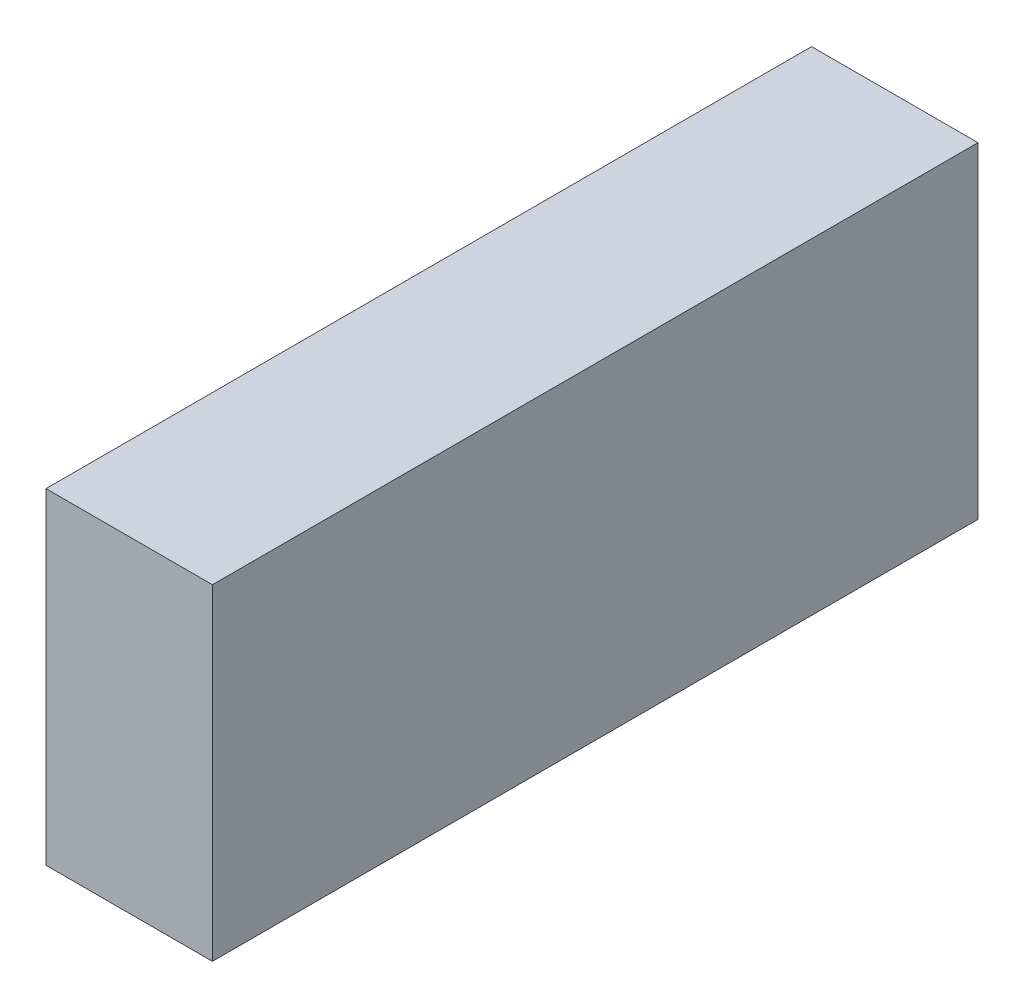
ISO-10303-21;
HEADER;
FILE_DESCRIPTION(('STEP AP214'),'2;1');
FILE_NAME('part.step','',(''),(''),'','','');
FILE_SCHEMA(('AUTOMOTIVE_DESIGN { 1 0 10303 214 1 1 1 1 }'));
ENDSEC;
DATA;
#1=APPLICATION_CONTEXT('core data for automotive mechanical design processes');
#2=APPLICATION_PROTOCOL_DEFINITION('international standard','automotive_design',2000,#1);
#3=PRODUCT_CONTEXT('',#1,'mechanical');
#4=PRODUCT('Part','Part','',(#3));
#5=PRODUCT_RELATED_PRODUCT_CATEGORY('part','',(#4));
#6=PRODUCT_DEFINITION_FORMATION('','',#4);
#7=PRODUCT_DEFINITION_CONTEXT('part definition',#1,'design');
#8=PRODUCT_DEFINITION('design','',#6,#7);
#9=PRODUCT_DEFINITION_SHAPE('','',#8);
#10=(LENGTH_UNIT() NAMED_UNIT(*) SI_UNIT(.MILLI.,.METRE.));
#11=(NAMED_UNIT(*) PLANE_ANGLE_UNIT() SI_UNIT($,.RADIAN.));
#12=(NAMED_UNIT(*) SI_UNIT($,.STERADIAN.) SOLID_ANGLE_UNIT());
#13=UNCERTAINTY_MEASURE_WITH_UNIT(LENGTH_MEASURE(1.E-05),#10,'distance_accuracy_value','');
#14=(GEOMETRIC_REPRESENTATION_CONTEXT(3) GLOBAL_UNCERTAINTY_ASSIGNED_CONTEXT((#13)) GLOBAL_UNIT_ASSIGNED_CONTEXT((#10,
#11,#12)) REPRESENTATION_CONTEXT('',''));
#15=CARTESIAN_POINT('',(0.,0.,0.));
#16=DIRECTION('',(0.,0.,1.));
#17=DIRECTION('',(1.,0.,0.));
#18=AXIS2_PLACEMENT_3D('',#15,#16,#17);
#19=CARTESIAN_POINT('',(0.,0.,230.));
#20=DIRECTION('',(1.,0.,0.));
#21=DIRECTION('',(0.,0.,-1.));
#22=AXIS2_PLACEMENT_3D('',#19,#20,#21);
#23=PLANE('',#22);
#24=DIRECTION('',(0.,-1.,0.));
#25=VECTOR('',#24,1.);
#26=CARTESIAN_POINT('',(0.,0.,0.));
#27=LINE('',#26,#25);
#28=CARTESIAN_POINT('',(0.,98.,0.));
#29=VERTEX_POINT('',#28);
#30=CARTESIAN_POINT('',(0.,0.,0.));
#31=VERTEX_POINT('',#30);
#32=EDGE_CURVE('E98',#29,#31,#27,.T.);
#33=ORIENTED_EDGE('',*,*,#32,.T.);
#34=DIRECTION('',(0.,0.,-1.));
#35=VECTOR('',#34,1.);
#36=CARTESIAN_POINT('',(0.,0.,230.));
#37=LINE('',#36,#35);
#38=CARTESIAN_POINT('',(0.,0.,230.));
#39=VERTEX_POINT('',#38);
#40=EDGE_CURVE('E11',#39,#31,#37,.T.);
#41=ORIENTED_EDGE('',*,*,#40,.F.);
#42=DIRECTION('',(0.,-1.,0.));
#43=VECTOR('',#42,1.);
#44=CARTESIAN_POINT('',(0.,0.,230.));
#45=LINE('',#44,#43);
#46=CARTESIAN_POINT('',(0.,98.,230.));
#47=VERTEX_POINT('',#46);
#48=EDGE_CURVE('E86',#47,#39,#45,.T.);
#49=ORIENTED_EDGE('',*,*,#48,.F.);
#50=DIRECTION('',(0.,0.,-1.));
#51=VECTOR('',#50,1.);
#52=CARTESIAN_POINT('',(0.,98.,230.));
#53=LINE('',#52,#51);
#54=EDGE_CURVE('E94',#47,#29,#53,.T.);
#55=ORIENTED_EDGE('',*,*,#54,.T.);
#56=EDGE_LOOP('',(#33,#41,#49,#55));
#57=FACE_BOUND('',#56,.T.);
#58=ADVANCED_FACE('F35',(#57),#23,.F.);
#59=CARTESIAN_POINT('',(0.,0.,230.));
#60=DIRECTION('',(0.,1.,0.));
#61=DIRECTION('',(0.,0.,1.));
#62=AXIS2_PLACEMENT_3D('',#59,#60,#61);
#63=PLANE('',#62);
#64=DIRECTION('',(1.,0.,0.));
#65=VECTOR('',#64,1.);
#66=CARTESIAN_POINT('',(0.,0.,0.));
#67=LINE('',#66,#65);
#68=CARTESIAN_POINT('',(50.,0.,0.));
#69=VERTEX_POINT('',#68);
#70=EDGE_CURVE('E90',#31,#69,#67,.T.);
#71=ORIENTED_EDGE('',*,*,#70,.T.);
#72=DIRECTION('',(0.,0.,-1.));
#73=VECTOR('',#72,1.);
#74=CARTESIAN_POINT('',(50.,0.,230.));
#75=LINE('',#74,#73);
#76=CARTESIAN_POINT('',(50.,0.,230.));
#77=VERTEX_POINT('',#76);
#78=EDGE_CURVE('E43',#77,#69,#75,.T.);
#79=ORIENTED_EDGE('',*,*,#78,.F.);
#80=DIRECTION('',(1.,0.,0.));
#81=VECTOR('',#80,1.);
#82=CARTESIAN_POINT('',(0.,0.,230.));
#83=LINE('',#82,#81);
#84=EDGE_CURVE('E81',#39,#77,#83,.T.);
#85=ORIENTED_EDGE('',*,*,#84,.F.);
#86=ORIENTED_EDGE('',*,*,#40,.T.);
#87=EDGE_LOOP('',(#71,#79,#85,#86));
#88=FACE_BOUND('',#87,.T.);
#89=ADVANCED_FACE('F89',(#88),#63,.F.);
#90=CARTESIAN_POINT('',(50.,0.,230.));
#91=DIRECTION('',(-1.,0.,0.));
#92=DIRECTION('',(0.,0.,1.));
#93=AXIS2_PLACEMENT_3D('',#90,#91,#92);
#94=PLANE('',#93);
#95=DIRECTION('',(0.,1.,0.));
#96=VECTOR('',#95,1.);
#97=CARTESIAN_POINT('',(50.,0.,0.));
#98=LINE('',#97,#96);
#99=CARTESIAN_POINT('',(50.,98.,0.));
#100=VERTEX_POINT('',#99);
#101=EDGE_CURVE('E68',#69,#100,#98,.T.);
#102=ORIENTED_EDGE('',*,*,#101,.T.);
#103=DIRECTION('',(0.,0.,-1.));
#104=VECTOR('',#103,1.);
#105=CARTESIAN_POINT('',(50.,98.,230.));
#106=LINE('',#105,#104);
#107=CARTESIAN_POINT('',(50.,98.,230.));
#108=VERTEX_POINT('',#107);
#109=EDGE_CURVE('E91',#108,#100,#106,.T.);
#110=ORIENTED_EDGE('',*,*,#109,.F.);
#111=DIRECTION('',(0.,1.,0.));
#112=VECTOR('',#111,1.);
#113=CARTESIAN_POINT('',(50.,0.,230.));
#114=LINE('',#113,#112);
#115=EDGE_CURVE('E84',#77,#108,#114,.T.);
#116=ORIENTED_EDGE('',*,*,#115,.F.);
#117=ORIENTED_EDGE('',*,*,#78,.T.);
#118=EDGE_LOOP('',(#102,#110,#116,#117));
#119=FACE_BOUND('',#118,.T.);
#120=ADVANCED_FACE('F92',(#119),#94,.F.);
#121=CARTESIAN_POINT('',(0.,98.,230.));
#122=DIRECTION('',(0.,-1.,0.));
#123=DIRECTION('',(0.,0.,-1.));
#124=AXIS2_PLACEMENT_3D('',#121,#122,#123);
#125=PLANE('',#124);
#126=DIRECTION('',(-1.,0.,0.));
#127=VECTOR('',#126,1.);
#128=CARTESIAN_POINT('',(0.,98.,0.));
#129=LINE('',#128,#127);
#130=EDGE_CURVE('E74',#100,#29,#129,.T.);
#131=ORIENTED_EDGE('',*,*,#130,.T.);
#132=ORIENTED_EDGE('',*,*,#54,.F.);
#133=DIRECTION('',(-1.,0.,0.));
#134=VECTOR('',#133,1.);
#135=CARTESIAN_POINT('',(0.,98.,230.));
#136=LINE('',#135,#134);
#137=EDGE_CURVE('E51',#108,#47,#136,.T.);
#138=ORIENTED_EDGE('',*,*,#137,.F.);
#139=ORIENTED_EDGE('',*,*,#109,.T.);
#140=EDGE_LOOP('',(#131,#132,#138,#139));
#141=FACE_BOUND('',#140,.T.);
#142=ADVANCED_FACE('F105',(#141),#125,.F.);
#143=CARTESIAN_POINT('',(0.,0.,230.));
#144=DIRECTION('',(0.,0.,-1.));
#145=DIRECTION('',(-1.,0.,0.));
#146=AXIS2_PLACEMENT_3D('',#143,#144,#145);
#147=PLANE('',#146);
#148=ORIENTED_EDGE('',*,*,#48,.T.);
#149=ORIENTED_EDGE('',*,*,#84,.T.);
#150=ORIENTED_EDGE('',*,*,#115,.T.);
#151=ORIENTED_EDGE('',*,*,#137,.T.);
#152=EDGE_LOOP('',(#148,#149,#150,#151));
#153=FACE_BOUND('',#152,.T.);
#154=ADVANCED_FACE('F82',(#153),#147,.F.);
#155=CARTESIAN_POINT('',(0.,0.,0.));
#156=DIRECTION('',(0.,0.,-1.));
#157=DIRECTION('',(-1.,0.,0.));
#158=AXIS2_PLACEMENT_3D('',#155,#156,#157);
#159=PLANE('',#158);
#160=ORIENTED_EDGE('',*,*,#32,.F.);
#161=ORIENTED_EDGE('',*,*,#130,.F.);
#162=ORIENTED_EDGE('',*,*,#101,.F.);
#163=ORIENTED_EDGE('',*,*,#70,.F.);
#164=EDGE_LOOP('',(#160,#161,#162,#163));
#165=FACE_BOUND('',#164,.T.);
#166=ADVANCED_FACE('F108',(#165),#159,.T.);
#167=CLOSED_SHELL('',(#58,#89,#120,#142,#154,#166));
#168=MANIFOLD_SOLID_BREP('B2',#167);
#169=ADVANCED_BREP_SHAPE_REPRESENTATION('',(#18,#168),#14);
#170=SHAPE_DEFINITION_REPRESENTATION(#9,#169);
ENDSEC;
END-ISO-10303-21;
